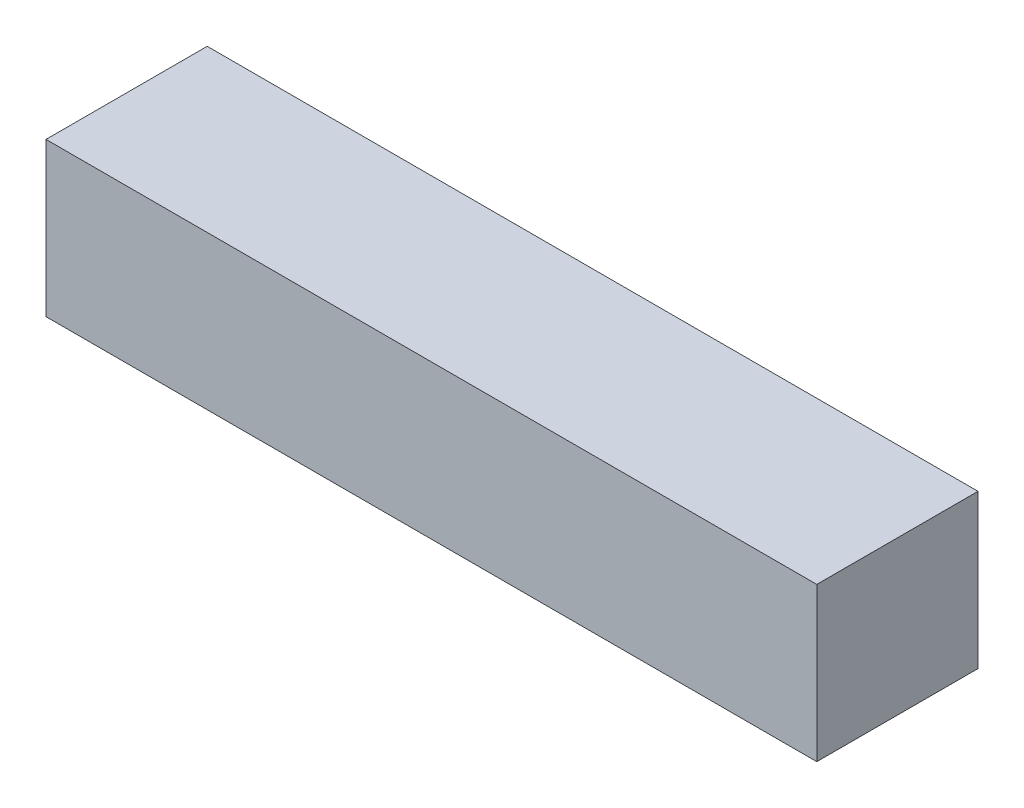
ISO-10303-21;
HEADER;
FILE_DESCRIPTION(('STEP AP214'),'2;1');
FILE_NAME('part.step','',(''),(''),'','','');
FILE_SCHEMA(('AUTOMOTIVE_DESIGN { 1 0 10303 214 1 1 1 1 }'));
ENDSEC;
DATA;
#1=APPLICATION_CONTEXT('core data for automotive mechanical design processes');
#2=APPLICATION_PROTOCOL_DEFINITION('international standard','automotive_design',2000,#1);
#3=PRODUCT_CONTEXT('',#1,'mechanical');
#4=PRODUCT('Part','Part','',(#3));
#5=PRODUCT_RELATED_PRODUCT_CATEGORY('part','',(#4));
#6=PRODUCT_DEFINITION_FORMATION('','',#4);
#7=PRODUCT_DEFINITION_CONTEXT('part definition',#1,'design');
#8=PRODUCT_DEFINITION('design','',#6,#7);
#9=PRODUCT_DEFINITION_SHAPE('','',#8);
#10=(LENGTH_UNIT() NAMED_UNIT(*) SI_UNIT(.MILLI.,.METRE.));
#11=(NAMED_UNIT(*) PLANE_ANGLE_UNIT() SI_UNIT($,.RADIAN.));
#12=(NAMED_UNIT(*) SI_UNIT($,.STERADIAN.) SOLID_ANGLE_UNIT());
#13=UNCERTAINTY_MEASURE_WITH_UNIT(LENGTH_MEASURE(1.E-05),#10,'distance_accuracy_value','');
#14=(GEOMETRIC_REPRESENTATION_CONTEXT(3) GLOBAL_UNCERTAINTY_ASSIGNED_CONTEXT((#13)) GLOBAL_UNIT_ASSIGNED_CONTEXT((#10,
#11,#12)) REPRESENTATION_CONTEXT('',''));
#15=CARTESIAN_POINT('',(0.,0.,0.));
#16=DIRECTION('',(0.,0.,1.));
#17=DIRECTION('',(1.,0.,0.));
#18=AXIS2_PLACEMENT_3D('',#15,#16,#17);
#19=CARTESIAN_POINT('',(10.04,4.,2.1));
#20=DIRECTION('',(-1.,0.,0.));
#21=DIRECTION('',(0.,0.,1.));
#22=AXIS2_PLACEMENT_3D('',#19,#20,#21);
#23=PLANE('',#22);
#24=DIRECTION('',(0.,0.,-1.));
#25=VECTOR('',#24,1.);
#26=CARTESIAN_POINT('',(10.04,0.,2.1));
#27=LINE('',#26,#25);
#28=CARTESIAN_POINT('',(10.04,0.,2.1));
#29=VERTEX_POINT('',#28);
#30=CARTESIAN_POINT('',(10.04,0.,-2.1));
#31=VERTEX_POINT('',#30);
#32=EDGE_CURVE('E111',#29,#31,#27,.T.);
#33=ORIENTED_EDGE('',*,*,#32,.T.);
#34=DIRECTION('',(0.,-1.,0.));
#35=VECTOR('',#34,1.);
#36=CARTESIAN_POINT('',(10.04,4.,-2.1));
#37=LINE('',#36,#35);
#38=CARTESIAN_POINT('',(10.04,4.,-2.1));
#39=VERTEX_POINT('',#38);
#40=EDGE_CURVE('E11',#39,#31,#37,.T.);
#41=ORIENTED_EDGE('',*,*,#40,.F.);
#42=DIRECTION('',(0.,0.,-1.));
#43=VECTOR('',#42,1.);
#44=CARTESIAN_POINT('',(10.04,4.,2.1));
#45=LINE('',#44,#43);
#46=CARTESIAN_POINT('',(10.04,4.,2.1));
#47=VERTEX_POINT('',#46);
#48=EDGE_CURVE('E95',#47,#39,#45,.T.);
#49=ORIENTED_EDGE('',*,*,#48,.F.);
#50=DIRECTION('',(0.,-1.,0.));
#51=VECTOR('',#50,1.);
#52=CARTESIAN_POINT('',(10.04,4.,2.1));
#53=LINE('',#52,#51);
#54=EDGE_CURVE('E107',#47,#29,#53,.T.);
#55=ORIENTED_EDGE('',*,*,#54,.T.);
#56=EDGE_LOOP('',(#33,#41,#49,#55));
#57=FACE_BOUND('',#56,.T.);
#58=ADVANCED_FACE('F43',(#57),#23,.F.);
#59=CARTESIAN_POINT('',(-10.04,4.,-2.1));
#60=DIRECTION('',(0.,0.,1.));
#61=DIRECTION('',(1.,0.,0.));
#62=AXIS2_PLACEMENT_3D('',#59,#60,#61);
#63=PLANE('',#62);
#64=DIRECTION('',(-1.,0.,0.));
#65=VECTOR('',#64,1.);
#66=CARTESIAN_POINT('',(-10.04,0.,-2.1));
#67=LINE('',#66,#65);
#68=CARTESIAN_POINT('',(-10.04,0.,-2.1));
#69=VERTEX_POINT('',#68);
#70=EDGE_CURVE('E100',#31,#69,#67,.T.);
#71=ORIENTED_EDGE('',*,*,#70,.T.);
#72=DIRECTION('',(0.,-1.,0.));
#73=VECTOR('',#72,1.);
#74=CARTESIAN_POINT('',(-10.04,4.,-2.1));
#75=LINE('',#74,#73);
#76=CARTESIAN_POINT('',(-10.04,4.,-2.1));
#77=VERTEX_POINT('',#76);
#78=EDGE_CURVE('E52',#77,#69,#75,.T.);
#79=ORIENTED_EDGE('',*,*,#78,.F.);
#80=DIRECTION('',(-1.,0.,0.));
#81=VECTOR('',#80,1.);
#82=CARTESIAN_POINT('',(-10.04,4.,-2.1));
#83=LINE('',#82,#81);
#84=EDGE_CURVE('E90',#39,#77,#83,.T.);
#85=ORIENTED_EDGE('',*,*,#84,.F.);
#86=ORIENTED_EDGE('',*,*,#40,.T.);
#87=EDGE_LOOP('',(#71,#79,#85,#86));
#88=FACE_BOUND('',#87,.T.);
#89=ADVANCED_FACE('F99',(#88),#63,.F.);
#90=CARTESIAN_POINT('',(-10.04,4.,2.1));
#91=DIRECTION('',(1.,0.,0.));
#92=DIRECTION('',(0.,0.,-1.));
#93=AXIS2_PLACEMENT_3D('',#90,#91,#92);
#94=PLANE('',#93);
#95=DIRECTION('',(0.,0.,1.));
#96=VECTOR('',#95,1.);
#97=CARTESIAN_POINT('',(-10.04,0.,2.1));
#98=LINE('',#97,#96);
#99=CARTESIAN_POINT('',(-10.04,0.,2.1));
#100=VERTEX_POINT('',#99);
#101=EDGE_CURVE('E77',#69,#100,#98,.T.);
#102=ORIENTED_EDGE('',*,*,#101,.T.);
#103=DIRECTION('',(0.,-1.,0.));
#104=VECTOR('',#103,1.);
#105=CARTESIAN_POINT('',(-10.04,4.,2.1));
#106=LINE('',#105,#104);
#107=CARTESIAN_POINT('',(-10.04,4.,2.1));
#108=VERTEX_POINT('',#107);
#109=EDGE_CURVE('E102',#108,#100,#106,.T.);
#110=ORIENTED_EDGE('',*,*,#109,.F.);
#111=DIRECTION('',(0.,0.,1.));
#112=VECTOR('',#111,1.);
#113=CARTESIAN_POINT('',(-10.04,4.,2.1));
#114=LINE('',#113,#112);
#115=EDGE_CURVE('E93',#77,#108,#114,.T.);
#116=ORIENTED_EDGE('',*,*,#115,.F.);
#117=ORIENTED_EDGE('',*,*,#78,.T.);
#118=EDGE_LOOP('',(#102,#110,#116,#117));
#119=FACE_BOUND('',#118,.T.);
#120=ADVANCED_FACE('F103',(#119),#94,.F.);
#121=CARTESIAN_POINT('',(-10.04,4.,2.1));
#122=DIRECTION('',(0.,0.,-1.));
#123=DIRECTION('',(-1.,0.,0.));
#124=AXIS2_PLACEMENT_3D('',#121,#122,#123);
#125=PLANE('',#124);
#126=DIRECTION('',(1.,0.,0.));
#127=VECTOR('',#126,1.);
#128=CARTESIAN_POINT('',(-10.04,0.,2.1));
#129=LINE('',#128,#127);
#130=EDGE_CURVE('E83',#100,#29,#129,.T.);
#131=ORIENTED_EDGE('',*,*,#130,.T.);
#132=ORIENTED_EDGE('',*,*,#54,.F.);
#133=DIRECTION('',(1.,0.,0.));
#134=VECTOR('',#133,1.);
#135=CARTESIAN_POINT('',(-10.04,4.,2.1));
#136=LINE('',#135,#134);
#137=EDGE_CURVE('E60',#108,#47,#136,.T.);
#138=ORIENTED_EDGE('',*,*,#137,.F.);
#139=ORIENTED_EDGE('',*,*,#109,.T.);
#140=EDGE_LOOP('',(#131,#132,#138,#139));
#141=FACE_BOUND('',#140,.T.);
#142=ADVANCED_FACE('F124',(#141),#125,.F.);
#143=CARTESIAN_POINT('',(0.,4.,0.));
#144=DIRECTION('',(0.,-1.,0.));
#145=DIRECTION('',(0.,0.,-1.));
#146=AXIS2_PLACEMENT_3D('',#143,#144,#145);
#147=PLANE('',#146);
#148=ORIENTED_EDGE('',*,*,#48,.T.);
#149=ORIENTED_EDGE('',*,*,#84,.T.);
#150=ORIENTED_EDGE('',*,*,#115,.T.);
#151=ORIENTED_EDGE('',*,*,#137,.T.);
#152=EDGE_LOOP('',(#148,#149,#150,#151));
#153=FACE_BOUND('',#152,.T.);
#154=ADVANCED_FACE('F91',(#153),#147,.F.);
#155=CARTESIAN_POINT('',(0.,0.,0.));
#156=DIRECTION('',(0.,-1.,0.));
#157=DIRECTION('',(0.,0.,-1.));
#158=AXIS2_PLACEMENT_3D('',#155,#156,#157);
#159=PLANE('',#158);
#160=ORIENTED_EDGE('',*,*,#32,.F.);
#161=ORIENTED_EDGE('',*,*,#130,.F.);
#162=ORIENTED_EDGE('',*,*,#101,.F.);
#163=ORIENTED_EDGE('',*,*,#70,.F.);
#164=EDGE_LOOP('',(#160,#161,#162,#163));
#165=FACE_BOUND('',#164,.T.);
#166=ADVANCED_FACE('F127',(#165),#159,.T.);
#167=CLOSED_SHELL('',(#58,#89,#120,#142,#154,#166));
#168=MANIFOLD_SOLID_BREP('B2',#167);
#169=ADVANCED_BREP_SHAPE_REPRESENTATION('',(#18,#168),#14);
#170=SHAPE_DEFINITION_REPRESENTATION(#9,#169);
ENDSEC;
END-ISO-10303-21;
